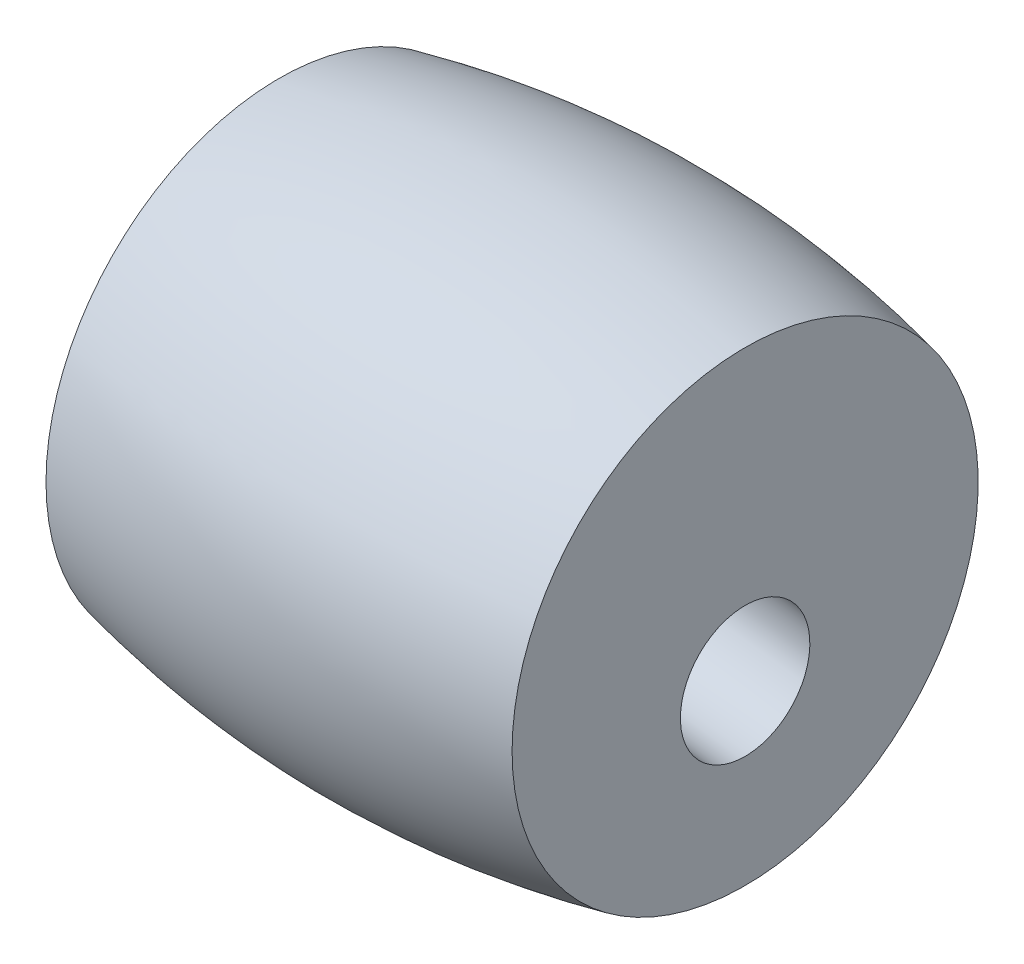
ISO-10303-21;
HEADER;
FILE_DESCRIPTION(('STEP AP214'),'2;1');
FILE_NAME('part.step','',(''),(''),'','','');
FILE_SCHEMA(('AUTOMOTIVE_DESIGN { 1 0 10303 214 1 1 1 1 }'));
ENDSEC;
DATA;
#1=APPLICATION_CONTEXT('core data for automotive mechanical design processes');
#2=APPLICATION_PROTOCOL_DEFINITION('international standard','automotive_design',2000,#1);
#3=PRODUCT_CONTEXT('',#1,'mechanical');
#4=PRODUCT('Part','Part','',(#3));
#5=PRODUCT_RELATED_PRODUCT_CATEGORY('part','',(#4));
#6=PRODUCT_DEFINITION_FORMATION('','',#4);
#7=PRODUCT_DEFINITION_CONTEXT('part definition',#1,'design');
#8=PRODUCT_DEFINITION('design','',#6,#7);
#9=PRODUCT_DEFINITION_SHAPE('','',#8);
#10=(LENGTH_UNIT() NAMED_UNIT(*) SI_UNIT(.MILLI.,.METRE.));
#11=(NAMED_UNIT(*) PLANE_ANGLE_UNIT() SI_UNIT($,.RADIAN.));
#12=(NAMED_UNIT(*) SI_UNIT($,.STERADIAN.) SOLID_ANGLE_UNIT());
#13=UNCERTAINTY_MEASURE_WITH_UNIT(LENGTH_MEASURE(1.E-05),#10,'distance_accuracy_value','');
#14=(GEOMETRIC_REPRESENTATION_CONTEXT(3) GLOBAL_UNCERTAINTY_ASSIGNED_CONTEXT((#13)) GLOBAL_UNIT_ASSIGNED_CONTEXT((#10,
#11,#12)) REPRESENTATION_CONTEXT('',''));
#15=CARTESIAN_POINT('',(0.,0.,0.));
#16=DIRECTION('',(0.,0.,1.));
#17=DIRECTION('',(1.,0.,0.));
#18=AXIS2_PLACEMENT_3D('',#15,#16,#17);
#19=CARTESIAN_POINT('',(9.,73.9999999999999,0.));
#20=CARTESIAN_POINT('',(0.,75.9999999999999,0.));
#21=CARTESIAN_POINT('',(-9.,73.9999999999999,0.));
#22=B_SPLINE_CURVE_WITH_KNOTS('',2,(#19,#20,#21),.UNSPECIFIED.,.F.,.F.,(3,3),(0.,1.),.UNSPECIFIED.);
#23=CARTESIAN_POINT('',(-1000.,65.,0.));
#24=DIRECTION('',(-1.,0.,0.));
#25=AXIS1_PLACEMENT('',#23,#24);
#26=SURFACE_OF_REVOLUTION('',#22,#25);
#27=CARTESIAN_POINT('',(-9.00000000000001,65.,0.));
#28=DIRECTION('',(-1.,0.,0.));
#29=DIRECTION('',(0.,0.,1.));
#30=AXIS2_PLACEMENT_3D('',#27,#28,#29);
#31=CIRCLE('',#30,8.99999999999987);
#32=CARTESIAN_POINT('',(-9.00000000000001,65.,8.99999999999987));
#33=VERTEX_POINT('',#32);
#34=EDGE_CURVE('E10',#33,#33,#31,.T.);
#35=ORIENTED_EDGE('',*,*,#34,.F.);
#36=EDGE_LOOP('',(#35));
#37=FACE_BOUND('',#36,.T.);
#38=CARTESIAN_POINT('',(8.9999999999999,65.,0.));
#39=DIRECTION('',(-1.,0.,0.));
#40=DIRECTION('',(0.,0.,1.));
#41=AXIS2_PLACEMENT_3D('',#38,#39,#40);
#42=CIRCLE('',#41,8.99999999999987);
#43=CARTESIAN_POINT('',(8.9999999999999,65.,8.99999999999987));
#44=VERTEX_POINT('',#43);
#45=EDGE_CURVE('E44',#44,#44,#42,.T.);
#46=ORIENTED_EDGE('',*,*,#45,.T.);
#47=EDGE_LOOP('',(#46));
#48=FACE_BOUND('',#47,.T.);
#49=ADVANCED_FACE('F32',(#37,#48),#26,.T.);
#50=CARTESIAN_POINT('',(-9.,73.9999999999999,0.));
#51=DIRECTION('',(1.,0.,0.));
#52=DIRECTION('',(0.,0.,-1.));
#53=AXIS2_PLACEMENT_3D('',#50,#51,#52);
#54=PLANE('',#53);
#55=CARTESIAN_POINT('',(-9.,60.5070648493595,-0.937012599182523));
#56=CARTESIAN_POINT('',(-9.,60.5602685529607,-1.06716569669475));
#57=CARTESIAN_POINT('',(-9.,60.624588382233,-1.19289139660101));
#58=CARTESIAN_POINT('',(-9.,60.773537559421,-1.4318224224085));
#59=CARTESIAN_POINT('',(-9.,60.8581932555893,-1.54501122453411));
#60=CARTESIAN_POINT('',(-9.,61.0451933198896,-1.75551137617383));
#61=CARTESIAN_POINT('',(-9.,61.1475213878328,-1.85283719758874));
#62=CARTESIAN_POINT('',(-9.,61.3669234390935,-2.02905685692218));
#63=CARTESIAN_POINT('',(-9.,61.4839938755686,-2.10795511530711));
#64=CARTESIAN_POINT('',(-9.,61.7305424518257,-2.24579177747274));
#65=CARTESIAN_POINT('',(-9.,61.8601097178912,-2.30457075730078));
#66=CARTESIAN_POINT('',(-9.,62.1272234304059,-2.39975532976775));
#67=CARTESIAN_POINT('',(-9.,62.2647705962102,-2.43615890191563));
#68=CARTESIAN_POINT('',(-9.,62.5451942764979,-2.48583627784454));
#69=CARTESIAN_POINT('',(-9.,62.6881062445018,-2.49891011817347));
#70=CARTESIAN_POINT('',(-9.,62.9741050367488,-2.50095901602755));
#71=CARTESIAN_POINT('',(-9.,63.1171918651932,-2.48993348269252));
#72=CARTESIAN_POINT('',(-9.,63.3999199871946,-2.44399648791848));
#73=CARTESIAN_POINT('',(-9.,63.5395497748239,-2.40901412411485));
#74=CARTESIAN_POINT('',(-9.,63.8109213281331,-2.31602118420399));
#75=CARTESIAN_POINT('',(-9.,63.9426631924926,-2.25801089625052));
#76=CARTESIAN_POINT('',(-9.,64.1939859218041,-2.12078724382862));
#77=CARTESIAN_POINT('',(-9.,64.3136088592745,-2.04165096281823));
#78=CARTESIAN_POINT('',(-9.,64.5377276348223,-1.86426153751832));
#79=CARTESIAN_POINT('',(-9.,64.6422240783339,-1.76600915871498));
#80=CARTESIAN_POINT('',(-9.,64.8321829765284,-1.5540386251753));
#81=CARTESIAN_POINT('',(-9.,64.9177962724327,-1.44045566218416));
#82=CARTESIAN_POINT('',(-9.,65.068526384895,-1.20041777747536));
#83=CARTESIAN_POINT('',(-9.,65.1336442985003,-1.07396354519222));
#84=CARTESIAN_POINT('',(-9.,65.240908851099,-0.813040254226183));
#85=CARTESIAN_POINT('',(-9.,65.283263761253,-0.678656799281528));
#86=CARTESIAN_POINT('',(-9.,65.3446460431612,-0.404664640479006));
#87=CARTESIAN_POINT('',(-9.,65.3636743969167,-0.265056156839369));
#88=CARTESIAN_POINT('',(-9.,65.3777826324281,0.0144562469827229));
#89=CARTESIAN_POINT('',(-9.,65.373016716672,0.154352406904708));
#90=CARTESIAN_POINT('',(-9.,65.3400354620051,0.431350257155974));
#91=CARTESIAN_POINT('',(-9.,65.3118204804723,0.568451990041391));
#92=CARTESIAN_POINT('',(-9.,65.2328294424535,0.835823765632321));
#93=CARTESIAN_POINT('',(-9.,65.1820785715995,0.966101253769076));
#94=CARTESIAN_POINT('',(-9.,65.0595227141064,1.21634150364112));
#95=CARTESIAN_POINT('',(-9.,64.9877173809477,1.33630409556924));
#96=CARTESIAN_POINT('',(-9.,64.8247693515183,1.56312612341887));
#97=CARTESIAN_POINT('',(-9.,64.7335388581051,1.66992246895259));
#98=CARTESIAN_POINT('',(-9.,64.5345806905706,1.86684363660561));
#99=CARTESIAN_POINT('',(-9.,64.4268523392,1.95696777398303));
#100=CARTESIAN_POINT('',(-9.,64.1969778794044,2.11881829643281));
#101=CARTESIAN_POINT('',(-9.,64.0747162495385,2.19038059447717));
#102=CARTESIAN_POINT('',(-9.,63.8199963706881,2.312178635712));
#103=CARTESIAN_POINT('',(-9.,63.6875376010927,2.36241328917399));
#104=CARTESIAN_POINT('',(-9.,63.4148840951082,2.44059465280186));
#105=CARTESIAN_POINT('',(-9.,63.274629684723,2.46833331128435));
#106=CARTESIAN_POINT('',(-9.,62.9914576275629,2.50002393978018));
#107=CARTESIAN_POINT('',(-9.,62.8485398768446,2.50397497946432));
#108=CARTESIAN_POINT('',(-9.,62.563199999792,2.48794666488329));
#109=CARTESIAN_POINT('',(-9.,62.4207858138228,2.46782553144073));
#110=CARTESIAN_POINT('',(-9.,62.1413529670447,2.40395995554075));
#111=CARTESIAN_POINT('',(-9.,62.0043343752121,2.36021521118846));
#112=CARTESIAN_POINT('',(-9.,61.7396285398134,2.25028991482449));
#113=CARTESIAN_POINT('',(-9.,61.6119401249071,2.18411218502442));
#114=CARTESIAN_POINT('',(-9.,61.3695827791494,2.03112428803425));
#115=CARTESIAN_POINT('',(-9.,61.2549135090867,1.9443146585868));
#116=CARTESIAN_POINT('',(-9.,61.0426823250221,1.75310190017073));
#117=CARTESIAN_POINT('',(-9.,60.9450135019912,1.64881746349014));
#118=CARTESIAN_POINT('',(-9.,60.7687939947014,1.42518764147357));
#119=CARTESIAN_POINT('',(-9.,60.6902414718686,1.30584370621288));
#120=CARTESIAN_POINT('',(-9.,60.5553491560825,1.05680967337377));
#121=CARTESIAN_POINT('',(-9.,60.4987867427065,0.927240149129729));
#122=CARTESIAN_POINT('',(-9.,60.4084357255254,0.660350170703106));
#123=CARTESIAN_POINT('',(-9.,60.3746515967131,0.52302819922404));
#124=CARTESIAN_POINT('',(-9.,60.3311070781411,0.245875216750484));
#125=CARTESIAN_POINT('',(-9.,60.3211390748832,0.106076671967616));
#126=CARTESIAN_POINT('',(-9.,60.3249406677865,-0.173077210725768));
#127=CARTESIAN_POINT('',(-9.,60.3386803481975,-0.312432885217768));
#128=CARTESIAN_POINT('',(-9.,60.3794283703359,-0.53297207223613));
#129=CARTESIAN_POINT('',(-9.,60.3991373778377,-0.615573296258421));
#130=CARTESIAN_POINT('',(-9.,60.4469033571179,-0.778324577679184));
#131=CARTESIAN_POINT('',(-9.,60.4749602755165,-0.858474650747644));
#132=CARTESIAN_POINT('',(-9.,60.5070648493595,-0.937012599182523));
#133=B_SPLINE_CURVE_WITH_KNOTS('',3,(#55,#56,#57,#58,#59,#60,#61,#62,#63,#64,#65,#66,#67,#68,
#69,#70,#71,#72,#73,#74,#75,#76,#77,#78,#79,#80,#81,#82,#83,#84,#85,#86,#87,#88,#89,#90,#91,#92,
#93,#94,#95,#96,#97,#98,#99,#100,#101,#102,#103,#104,#105,#106,#107,#108,#109,#110,#111,#112,
#113,#114,#115,#116,#117,#118,#119,#120,#121,#122,#123,#124,#125,#126,#127,#128,#129,#130,#131,
#132),.UNSPECIFIED.,.T.,.F.,(4,2,2,2,2,2,2,2,2,2,2,2,2,2,2,2,2,2,2,2,2,2,2,2,2,2,2,2,2,2,2,2,2,
2,2,2,2,2,4),(0.,0.421508774106049,0.843566651775147,1.26523730154773,1.68680669540413,
2.11164317748858,2.53651801651662,2.96501735582859,3.39352720105806,3.82331077133506,
4.25308896379976,4.68131994345586,5.10953377853266,5.53419200618263,5.95882749946843,
6.3795086066434,6.80017200337931,7.21811277762631,7.63604718231944,8.05351568333234,
8.47099105553209,8.89039496647283,9.30981609886944,9.73282744562456,10.1558604033949,
10.5827624945988,11.009681281753,11.439126943389,11.8685780932,12.297975235376,12.7273611871218,
13.1539408389928,13.5804794469165,14.0025798920105,14.4247632382747,14.8432526175665,
15.2612143084403,15.5155658888302,15.7699158428332),.UNSPECIFIED.);
#134=CARTESIAN_POINT('',(-9.,60.5070648493595,-0.937012599182523));
#135=VERTEX_POINT('',#134);
#136=EDGE_CURVE('E48',#135,#135,#133,.T.);
#137=ORIENTED_EDGE('',*,*,#136,.T.);
#138=EDGE_LOOP('',(#137));
#139=FACE_BOUND('',#138,.T.);
#140=ORIENTED_EDGE('',*,*,#34,.T.);
#141=EDGE_LOOP('',(#140));
#142=FACE_BOUND('',#141,.T.);
#143=ADVANCED_FACE('F60',(#139,#142),#54,.F.);
#144=CARTESIAN_POINT('',(9.,65.,0.));
#145=DIRECTION('',(-1.,0.,0.));
#146=DIRECTION('',(0.,0.,1.));
#147=AXIS2_PLACEMENT_3D('',#144,#145,#146);
#148=PLANE('',#147);
#149=CARTESIAN_POINT('',(9.,60.5070648493595,-0.937012599182523));
#150=CARTESIAN_POINT('',(9.,60.4544529146404,-0.808273664938739));
#151=CARTESIAN_POINT('',(9.,60.4126389225046,-0.675017175703552));
#152=CARTESIAN_POINT('',(9.,60.3519425592957,-0.403270212692311));
#153=CARTESIAN_POINT('',(9.,60.3330857434037,-0.264774082749481));
#154=CARTESIAN_POINT('',(9.,60.3189340337987,0.0133793745829173));
#155=CARTESIAN_POINT('',(9.,60.3236305990796,0.153036262716611));
#156=CARTESIAN_POINT('',(9.,60.3564272416988,0.429537100825701));
#157=CARTESIAN_POINT('',(9.,60.3845219671445,0.566381686728996));
#158=CARTESIAN_POINT('',(9.,60.463229151238,0.833330766994368));
#159=CARTESIAN_POINT('',(9.,60.5138265099993,0.963439715902597));
#160=CARTESIAN_POINT('',(9.,60.6360280851724,1.21338828224968));
#161=CARTESIAN_POINT('',(9.,60.7076334765119,1.33322732483335));
#162=CARTESIAN_POINT('',(9.,60.8702156206563,1.55998701513619));
#163=CARTESIAN_POINT('',(9.,60.9613003415212,1.66683022853345));
#164=CARTESIAN_POINT('',(9.,61.1599533768667,1.86389656283677));
#165=CARTESIAN_POINT('',(9.,61.2675224909535,1.95411887704722));
#166=CARTESIAN_POINT('',(9.,61.4972391158572,2.11634865644363));
#167=CARTESIAN_POINT('',(9.,61.6195218200264,2.18816468296556));
#168=CARTESIAN_POINT('',(9.,61.8743214199655,2.31047511909643));
#169=CARTESIAN_POINT('',(9.,62.0068388579627,2.36096839812707));
#170=CARTESIAN_POINT('',(9.,62.2797169611667,2.4396787952964));
#171=CARTESIAN_POINT('',(9.,62.4201408132565,2.46767694923739));
#172=CARTESIAN_POINT('',(9.,62.7036941092487,2.49983127218609));
#173=CARTESIAN_POINT('',(9.,62.8468236521661,2.50398656696173));
#174=CARTESIAN_POINT('',(9.,63.1324796887385,2.48829462628955));
#175=CARTESIAN_POINT('',(9.,63.2749996397375,2.46832787611633));
#176=CARTESIAN_POINT('',(9.,63.5546562285185,2.40471417945929));
#177=CARTESIAN_POINT('',(9.,63.6917928615194,2.36106721194519));
#178=CARTESIAN_POINT('',(9.,63.9565295664976,2.25135289974133));
#179=CARTESIAN_POINT('',(9.,64.084144616233,2.18532171381568));
#180=CARTESIAN_POINT('',(9.,64.3263701426605,2.03262411175949));
#181=CARTESIAN_POINT('',(9.,64.4409810475331,1.945958375343));
#182=CARTESIAN_POINT('',(9.,64.6530466091847,1.75509500899482));
#183=CARTESIAN_POINT('',(9.,64.7506183100386,1.65102744832846));
#184=CARTESIAN_POINT('',(9.,64.9267038406926,1.42785329369993));
#185=CARTESIAN_POINT('',(9.,65.0052186594019,1.30874748059812));
#186=CARTESIAN_POINT('',(9.,65.140179757166,1.06008510635285));
#187=CARTESIAN_POINT('',(9.,65.1968272997727,0.930637773058729));
#188=CARTESIAN_POINT('',(9.,65.2873930734412,0.664022444437038));
#189=CARTESIAN_POINT('',(9.,65.3213123915124,0.526854818683499));
#190=CARTESIAN_POINT('',(9.,65.3652227724059,0.24983097097725));
#191=CARTESIAN_POINT('',(9.,65.3753966488671,0.110003702355443));
#192=CARTESIAN_POINT('',(9.,65.3720478423821,-0.169364788304898));
#193=CARTESIAN_POINT('',(9.,65.3585257498931,-0.308906017384237));
#194=CARTESIAN_POINT('',(9.,65.308267520963,-0.58331350970175));
#195=CARTESIAN_POINT('',(9.,65.2716000139756,-0.718192354749463));
#196=CARTESIAN_POINT('',(9.,65.1762049750269,-0.979906020290134));
#197=CARTESIAN_POINT('',(9.,65.117477286254,-1.10674078359545));
#198=CARTESIAN_POINT('',(9.,64.979487320268,-1.34918544686969));
#199=CARTESIAN_POINT('',(9.,64.9001657483521,-1.46476158689385));
#200=CARTESIAN_POINT('',(9.,64.7233814669988,-1.68108460748081));
#201=CARTESIAN_POINT('',(9.,64.6259181473198,-1.78183098900461));
#202=CARTESIAN_POINT('',(9.,64.4148371157748,-1.96647120943653));
#203=CARTESIAN_POINT('',(9.,64.3011018980008,-2.0502306962098));
#204=CARTESIAN_POINT('',(9.,64.0612905123281,-2.19767522892742));
#205=CARTESIAN_POINT('',(9.,63.9352137081497,-2.26135923915068));
#206=CARTESIAN_POINT('',(9.,63.6730315063694,-2.36746805885887));
#207=CARTESIAN_POINT('',(9.,63.5368431662351,-2.40968795017833));
#208=CARTESIAN_POINT('',(9.,63.2593353575076,-2.47085070322403));
#209=CARTESIAN_POINT('',(9.,63.1180156458755,-2.48979246093596));
#210=CARTESIAN_POINT('',(9.,62.8331497095094,-2.50396043957677));
#211=CARTESIAN_POINT('',(9.,62.6895947564765,-2.49901166597968));
#212=CARTESIAN_POINT('',(9.,62.4053448901917,-2.46513651478911));
#213=CARTESIAN_POINT('',(9.,62.2646499293561,-2.43621053645485));
#214=CARTESIAN_POINT('',(9.,61.989849761014,-2.35508532107316));
#215=CARTESIAN_POINT('',(9.,61.8557572609722,-2.30284301382373));
#216=CARTESIAN_POINT('',(9.,61.5982676043744,-2.17646915796954));
#217=CARTESIAN_POINT('',(9.,61.4748729404915,-2.10233252546602));
#218=CARTESIAN_POINT('',(9.,61.242923498939,-1.93458322002553));
#219=CARTESIAN_POINT('',(9.,61.134308616938,-1.84105358651118));
#220=CARTESIAN_POINT('',(9.,60.9346185548515,-1.63699283424166));
#221=CARTESIAN_POINT('',(9.,60.8435214479987,-1.52648328502698));
#222=CARTESIAN_POINT('',(9.,60.7116323154616,-1.33530606603426));
#223=CARTESIAN_POINT('',(9.,60.6647184443254,-1.25878567256788));
#224=CARTESIAN_POINT('',(9.,60.579395174012,-1.1011403326785));
#225=CARTESIAN_POINT('',(9.,60.5409857329893,-1.02001540891425));
#226=CARTESIAN_POINT('',(9.,60.5070648493595,-0.937012599182523));
#227=B_SPLINE_CURVE_WITH_KNOTS('',3,(#149,#150,#151,#152,#153,#154,#155,#156,#157,#158,#159,
#160,#161,#162,#163,#164,#165,#166,#167,#168,#169,#170,#171,#172,#173,#174,#175,#176,#177,#178,
#179,#180,#181,#182,#183,#184,#185,#186,#187,#188,#189,#190,#191,#192,#193,#194,#195,#196,#197,
#198,#199,#200,#201,#202,#203,#204,#205,#206,#207,#208,#209,#210,#211,#212,#213,#214,#215,#216,
#217,#218,#219,#220,#221,#222,#223,#224,#225,#226),.UNSPECIFIED.,.T.,.F.,(4,2,2,2,2,2,2,2,2,2,2,
2,2,2,2,2,2,2,2,2,2,2,2,2,2,2,2,2,2,2,2,2,2,2,2,2,2,2,4),(0.,0.416898010670564,
0.834259675547557,1.25147000628194,1.6685849341391,2.08542038771974,2.50227915833119,
2.92151127773257,3.34076373921387,3.76421433633295,4.18768738290259,4.61523414290297,
5.04279657940844,5.47248612643472,5.90217605506644,6.33117515768788,6.76016013078494,
7.18607133355254,7.61196042999445,8.03383051374744,8.45568041952901,8.87427167855799,
9.29285250725933,9.71019797717473,10.1275464137841,10.5461100858888,10.9646878399402,
11.3864571136975,11.8082481435444,12.2339937635653,12.6597595746859,13.088648767624,
13.5175308190069,13.9472084066449,14.3769858446859,14.8049596655233,15.2323942596701,
15.5011853346489,15.7699750870303),.UNSPECIFIED.);
#228=CARTESIAN_POINT('',(9.,60.5070648493595,-0.937012599182523));
#229=VERTEX_POINT('',#228);
#230=EDGE_CURVE('E36',#229,#229,#227,.T.);
#231=ORIENTED_EDGE('',*,*,#230,.T.);
#232=EDGE_LOOP('',(#231));
#233=FACE_BOUND('',#232,.T.);
#234=ORIENTED_EDGE('',*,*,#45,.F.);
#235=EDGE_LOOP('',(#234));
#236=FACE_BOUND('',#235,.T.);
#237=ADVANCED_FACE('F65',(#233,#236),#148,.F.);
#238=CARTESIAN_POINT('',(0.,0.,0.));
#239=DIRECTION('',(0.,0.,-1.));
#240=DIRECTION('',(-1.,0.,0.));
#241=AXIS2_PLACEMENT_3D('',#238,#239,#240);
#242=TOROIDAL_SURFACE('',#241,63.490505486506,2.5);
#243=ORIENTED_EDGE('',*,*,#230,.F.);
#244=EDGE_LOOP('',(#243));
#245=FACE_BOUND('',#244,.T.);
#246=ORIENTED_EDGE('',*,*,#136,.F.);
#247=EDGE_LOOP('',(#246));
#248=FACE_BOUND('',#247,.T.);
#249=ADVANCED_FACE('F62',(#245,#248),#242,.F.);
#250=CLOSED_SHELL('',(#49,#143,#237,#249));
#251=MANIFOLD_SOLID_BREP('B2',#250);
#252=ADVANCED_BREP_SHAPE_REPRESENTATION('',(#18,#251),#14);
#253=SHAPE_DEFINITION_REPRESENTATION(#9,#252);
ENDSEC;
END-ISO-10303-21;
